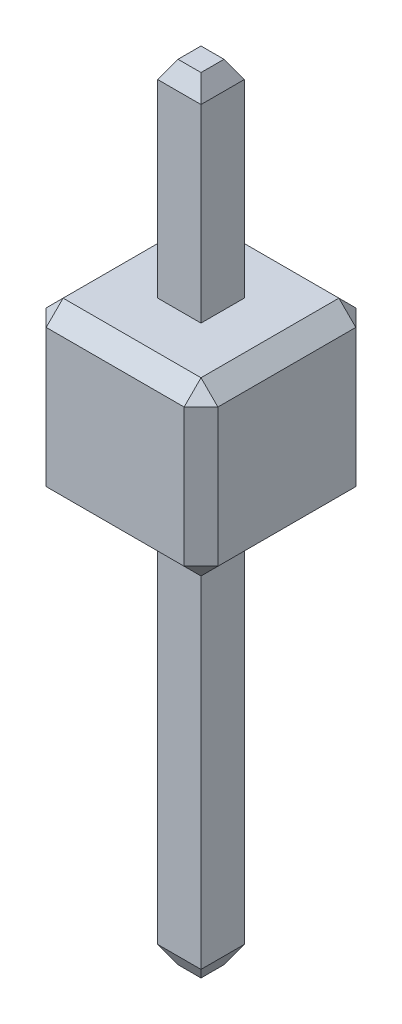
ISO-10303-21;
HEADER;
FILE_DESCRIPTION(('STEP AP214'),'2;1');
FILE_NAME('part.step','',(''),(''),'','','');
FILE_SCHEMA(('AUTOMOTIVE_DESIGN { 1 0 10303 214 1 1 1 1 }'));
ENDSEC;
DATA;
#1=APPLICATION_CONTEXT('core data for automotive mechanical design processes');
#2=APPLICATION_PROTOCOL_DEFINITION('international standard','automotive_design',2000,#1);
#3=PRODUCT_CONTEXT('',#1,'mechanical');
#4=PRODUCT('Part','Part','',(#3));
#5=PRODUCT_RELATED_PRODUCT_CATEGORY('part','',(#4));
#6=PRODUCT_DEFINITION_FORMATION('','',#4);
#7=PRODUCT_DEFINITION_CONTEXT('part definition',#1,'design');
#8=PRODUCT_DEFINITION('design','',#6,#7);
#9=PRODUCT_DEFINITION_SHAPE('','',#8);
#10=(LENGTH_UNIT() NAMED_UNIT(*) SI_UNIT(.MILLI.,.METRE.));
#11=(NAMED_UNIT(*) PLANE_ANGLE_UNIT() SI_UNIT($,.RADIAN.));
#12=(NAMED_UNIT(*) SI_UNIT($,.STERADIAN.) SOLID_ANGLE_UNIT());
#13=UNCERTAINTY_MEASURE_WITH_UNIT(LENGTH_MEASURE(1.E-05),#10,'distance_accuracy_value','');
#14=(GEOMETRIC_REPRESENTATION_CONTEXT(3) GLOBAL_UNCERTAINTY_ASSIGNED_CONTEXT((#13)) GLOBAL_UNIT_ASSIGNED_CONTEXT((#10,
#11,#12)) REPRESENTATION_CONTEXT('',''));
#15=CARTESIAN_POINT('',(0.,0.,0.));
#16=DIRECTION('',(0.,0.,1.));
#17=DIRECTION('',(1.,0.,0.));
#18=AXIS2_PLACEMENT_3D('',#15,#16,#17);
#19=CARTESIAN_POINT('',(0.319999999999999,5.8,0.32));
#20=DIRECTION('',(-1.,0.,0.));
#21=DIRECTION('',(0.,-1.,0.));
#22=AXIS2_PLACEMENT_3D('',#19,#20,#21);
#23=PLANE('',#22);
#24=DIRECTION('',(0.,1.,0.));
#25=VECTOR('',#24,1.);
#26=CARTESIAN_POINT('',(0.319999999999999,5.8,0.32));
#27=LINE('',#26,#25);
#28=CARTESIAN_POINT('',(0.320000000000001,-5.54,0.32));
#29=VERTEX_POINT('',#28);
#30=CARTESIAN_POINT('',(0.32,0.199999999999997,0.32));
#31=VERTEX_POINT('',#30);
#32=EDGE_CURVE('E608',#29,#31,#27,.T.);
#33=ORIENTED_EDGE('',*,*,#32,.F.);
#34=DIRECTION('',(0.,0.,-1.));
#35=VECTOR('',#34,1.);
#36=CARTESIAN_POINT('',(0.320000000000001,-5.54,0.32));
#37=LINE('',#36,#35);
#38=CARTESIAN_POINT('',(0.320000000000001,-5.54,-0.32));
#39=VERTEX_POINT('',#38);
#40=EDGE_CURVE('E314',#29,#39,#37,.T.);
#41=ORIENTED_EDGE('',*,*,#40,.T.);
#42=DIRECTION('',(0.,1.,0.));
#43=VECTOR('',#42,1.);
#44=CARTESIAN_POINT('',(0.319999999999999,5.8,-0.32));
#45=LINE('',#44,#43);
#46=CARTESIAN_POINT('',(0.32,0.199999999999997,-0.32));
#47=VERTEX_POINT('',#46);
#48=EDGE_CURVE('E228',#39,#47,#45,.T.);
#49=ORIENTED_EDGE('',*,*,#48,.T.);
#50=DIRECTION('',(0.,0.,-1.));
#51=VECTOR('',#50,1.);
#52=CARTESIAN_POINT('',(0.32,0.199999999999998,0.32));
#53=LINE('',#52,#51);
#54=EDGE_CURVE('E600',#31,#47,#53,.T.);
#55=ORIENTED_EDGE('',*,*,#54,.F.);
#56=EDGE_LOOP('',(#33,#41,#49,#55));
#57=FACE_BOUND('',#56,.T.);
#58=ADVANCED_FACE('F53',(#57),#23,.F.);
#59=CARTESIAN_POINT('',(-0.320000000000001,5.8,0.32));
#60=DIRECTION('',(1.,0.,0.));
#61=DIRECTION('',(0.,1.,0.));
#62=AXIS2_PLACEMENT_3D('',#59,#60,#61);
#63=PLANE('',#62);
#64=DIRECTION('',(0.,-1.,0.));
#65=VECTOR('',#64,1.);
#66=CARTESIAN_POINT('',(-0.320000000000001,5.8,-0.32));
#67=LINE('',#66,#65);
#68=CARTESIAN_POINT('',(-0.320000000000001,0.199999999999997,-0.32));
#69=VERTEX_POINT('',#68);
#70=CARTESIAN_POINT('',(-0.319999999999999,-5.54,-0.32));
#71=VERTEX_POINT('',#70);
#72=EDGE_CURVE('E611',#69,#71,#67,.T.);
#73=ORIENTED_EDGE('',*,*,#72,.T.);
#74=DIRECTION('',(0.,0.,1.));
#75=VECTOR('',#74,1.);
#76=CARTESIAN_POINT('',(-0.319999999999999,-5.54,0.32));
#77=LINE('',#76,#75);
#78=CARTESIAN_POINT('',(-0.319999999999999,-5.54,0.32));
#79=VERTEX_POINT('',#78);
#80=EDGE_CURVE('E320',#71,#79,#77,.T.);
#81=ORIENTED_EDGE('',*,*,#80,.T.);
#82=DIRECTION('',(0.,-1.,0.));
#83=VECTOR('',#82,1.);
#84=CARTESIAN_POINT('',(-0.320000000000001,5.8,0.32));
#85=LINE('',#84,#83);
#86=CARTESIAN_POINT('',(-0.32,0.199999999999997,0.32));
#87=VERTEX_POINT('',#86);
#88=EDGE_CURVE('E254',#87,#79,#85,.T.);
#89=ORIENTED_EDGE('',*,*,#88,.F.);
#90=DIRECTION('',(0.,0.,1.));
#91=VECTOR('',#90,1.);
#92=CARTESIAN_POINT('',(-0.32,0.199999999999998,0.32));
#93=LINE('',#92,#91);
#94=EDGE_CURVE('E596',#69,#87,#93,.T.);
#95=ORIENTED_EDGE('',*,*,#94,.F.);
#96=EDGE_LOOP('',(#73,#81,#89,#95));
#97=FACE_BOUND('',#96,.T.);
#98=ADVANCED_FACE('F532',(#97),#63,.F.);
#99=CARTESIAN_POINT('',(0.,0.,0.32));
#100=DIRECTION('',(0.,0.,1.));
#101=DIRECTION('',(1.,0.,0.));
#102=AXIS2_PLACEMENT_3D('',#99,#100,#101);
#103=PLANE('',#102);
#104=ORIENTED_EDGE('',*,*,#88,.T.);
#105=DIRECTION('',(1.,0.,0.));
#106=VECTOR('',#105,1.);
#107=CARTESIAN_POINT('',(0.320000000000001,-5.54,0.32));
#108=LINE('',#107,#106);
#109=EDGE_CURVE('E282',#79,#29,#108,.T.);
#110=ORIENTED_EDGE('',*,*,#109,.T.);
#111=ORIENTED_EDGE('',*,*,#32,.T.);
#112=DIRECTION('',(-1.,0.,0.));
#113=VECTOR('',#112,1.);
#114=CARTESIAN_POINT('',(0.,0.199999999999997,0.32));
#115=LINE('',#114,#113);
#116=EDGE_CURVE('E229',#31,#87,#115,.T.);
#117=ORIENTED_EDGE('',*,*,#116,.T.);
#118=EDGE_LOOP('',(#104,#110,#111,#117));
#119=FACE_BOUND('',#118,.T.);
#120=ADVANCED_FACE('F539',(#119),#103,.T.);
#121=CARTESIAN_POINT('',(0.,0.,-0.32));
#122=DIRECTION('',(0.,0.,1.));
#123=DIRECTION('',(1.,0.,0.));
#124=AXIS2_PLACEMENT_3D('',#121,#122,#123);
#125=PLANE('',#124);
#126=ORIENTED_EDGE('',*,*,#48,.F.);
#127=DIRECTION('',(-1.,0.,0.));
#128=VECTOR('',#127,1.);
#129=CARTESIAN_POINT('',(0.,-5.54,-0.32));
#130=LINE('',#129,#128);
#131=EDGE_CURVE('E317',#39,#71,#130,.T.);
#132=ORIENTED_EDGE('',*,*,#131,.T.);
#133=ORIENTED_EDGE('',*,*,#72,.F.);
#134=DIRECTION('',(-1.,0.,0.));
#135=VECTOR('',#134,1.);
#136=CARTESIAN_POINT('',(0.,0.199999999999997,-0.32));
#137=LINE('',#136,#135);
#138=EDGE_CURVE('E246',#47,#69,#137,.T.);
#139=ORIENTED_EDGE('',*,*,#138,.F.);
#140=EDGE_LOOP('',(#126,#132,#133,#139));
#141=FACE_BOUND('',#140,.T.);
#142=ADVANCED_FACE('F573',(#141),#125,.F.);
#143=CARTESIAN_POINT('',(-0.319999999999999,-5.8,0.32));
#144=DIRECTION('',(0.,1.,0.));
#145=DIRECTION('',(0.,0.,1.));
#146=AXIS2_PLACEMENT_3D('',#143,#144,#145);
#147=PLANE('',#146);
#148=DIRECTION('',(0.,0.,1.));
#149=VECTOR('',#148,1.);
#150=CARTESIAN_POINT('',(0.169999999999999,-5.8,0.32));
#151=LINE('',#150,#149);
#152=CARTESIAN_POINT('',(0.169999999999999,-5.8,-0.169999999999998));
#153=VERTEX_POINT('',#152);
#154=CARTESIAN_POINT('',(0.169999999999999,-5.8,0.169999999999998));
#155=VERTEX_POINT('',#154);
#156=EDGE_CURVE('E307',#153,#155,#151,.T.);
#157=ORIENTED_EDGE('',*,*,#156,.T.);
#158=DIRECTION('',(-1.,0.,0.));
#159=VECTOR('',#158,1.);
#160=CARTESIAN_POINT('',(-0.319999999999999,-5.8,0.169999999999998));
#161=LINE('',#160,#159);
#162=CARTESIAN_POINT('',(-0.169999999999998,-5.8,0.169999999999998));
#163=VERTEX_POINT('',#162);
#164=EDGE_CURVE('E310',#155,#163,#161,.T.);
#165=ORIENTED_EDGE('',*,*,#164,.T.);
#166=DIRECTION('',(0.,0.,-1.));
#167=VECTOR('',#166,1.);
#168=CARTESIAN_POINT('',(-0.169999999999998,-5.8,0.32));
#169=LINE('',#168,#167);
#170=CARTESIAN_POINT('',(-0.169999999999998,-5.8,-0.169999999999998));
#171=VERTEX_POINT('',#170);
#172=EDGE_CURVE('E301',#163,#171,#169,.T.);
#173=ORIENTED_EDGE('',*,*,#172,.T.);
#174=DIRECTION('',(1.,0.,0.));
#175=VECTOR('',#174,1.);
#176=CARTESIAN_POINT('',(-0.319999999999999,-5.8,-0.169999999999998));
#177=LINE('',#176,#175);
#178=EDGE_CURVE('E304',#171,#153,#177,.T.);
#179=ORIENTED_EDGE('',*,*,#178,.T.);
#180=EDGE_LOOP('',(#157,#165,#173,#179));
#181=FACE_BOUND('',#180,.T.);
#182=ADVANCED_FACE('F564',(#181),#147,.F.);
#183=CARTESIAN_POINT('',(-1.27,2.74,1.27));
#184=DIRECTION('',(1.,0.,0.));
#185=DIRECTION('',(0.,1.,0.));
#186=AXIS2_PLACEMENT_3D('',#183,#184,#185);
#187=PLANE('',#186);
#188=DIRECTION('',(0.,1.,0.));
#189=VECTOR('',#188,1.);
#190=CARTESIAN_POINT('',(-1.27,2.74,1.02));
#191=LINE('',#190,#189);
#192=CARTESIAN_POINT('',(-1.27,0.449999999999999,1.02));
#193=VERTEX_POINT('',#192);
#194=CARTESIAN_POINT('',(-1.27,2.49,1.02));
#195=VERTEX_POINT('',#194);
#196=EDGE_CURVE('E342',#193,#195,#191,.T.);
#197=ORIENTED_EDGE('',*,*,#196,.T.);
#198=DIRECTION('',(0.,0.,-1.));
#199=VECTOR('',#198,1.);
#200=CARTESIAN_POINT('',(-1.27,2.49,1.27));
#201=LINE('',#200,#199);
#202=CARTESIAN_POINT('',(-1.27,2.49,-1.02));
#203=VERTEX_POINT('',#202);
#204=EDGE_CURVE('E345',#195,#203,#201,.T.);
#205=ORIENTED_EDGE('',*,*,#204,.T.);
#206=DIRECTION('',(0.,-1.,0.));
#207=VECTOR('',#206,1.);
#208=CARTESIAN_POINT('',(-1.27,0.199999999999997,-1.02));
#209=LINE('',#208,#207);
#210=CARTESIAN_POINT('',(-1.27,0.449999999999999,-1.02));
#211=VERTEX_POINT('',#210);
#212=EDGE_CURVE('E323',#203,#211,#209,.T.);
#213=ORIENTED_EDGE('',*,*,#212,.T.);
#214=DIRECTION('',(0.,0.,1.));
#215=VECTOR('',#214,1.);
#216=CARTESIAN_POINT('',(-1.27,0.449999999999999,1.27));
#217=LINE('',#216,#215);
#218=EDGE_CURVE('E339',#211,#193,#217,.T.);
#219=ORIENTED_EDGE('',*,*,#218,.T.);
#220=EDGE_LOOP('',(#197,#205,#213,#219));
#221=FACE_BOUND('',#220,.T.);
#222=ADVANCED_FACE('F648',(#221),#187,.F.);
#223=CARTESIAN_POINT('',(1.27,0.199999999999998,1.27));
#224=DIRECTION('',(0.,1.,0.));
#225=DIRECTION('',(-1.,0.,0.));
#226=AXIS2_PLACEMENT_3D('',#223,#224,#225);
#227=PLANE('',#226);
#228=DIRECTION('',(1.,0.,0.));
#229=VECTOR('',#228,1.);
#230=CARTESIAN_POINT('',(1.27,0.199999999999998,-1.02));
#231=LINE('',#230,#229);
#232=CARTESIAN_POINT('',(-1.02,0.199999999999997,-1.02));
#233=VERTEX_POINT('',#232);
#234=CARTESIAN_POINT('',(1.02,0.199999999999998,-1.02));
#235=VERTEX_POINT('',#234);
#236=EDGE_CURVE('E401',#233,#235,#231,.T.);
#237=ORIENTED_EDGE('',*,*,#236,.T.);
#238=DIRECTION('',(0.,0.,1.));
#239=VECTOR('',#238,1.);
#240=CARTESIAN_POINT('',(1.02,0.199999999999998,1.27));
#241=LINE('',#240,#239);
#242=CARTESIAN_POINT('',(1.02,0.199999999999998,1.02));
#243=VERTEX_POINT('',#242);
#244=EDGE_CURVE('E11',#235,#243,#241,.T.);
#245=ORIENTED_EDGE('',*,*,#244,.T.);
#246=DIRECTION('',(-1.,0.,0.));
#247=VECTOR('',#246,1.);
#248=CARTESIAN_POINT('',(1.27,0.199999999999998,1.02));
#249=LINE('',#248,#247);
#250=CARTESIAN_POINT('',(-1.02,0.199999999999997,1.02));
#251=VERTEX_POINT('',#250);
#252=EDGE_CURVE('E64',#243,#251,#249,.T.);
#253=ORIENTED_EDGE('',*,*,#252,.T.);
#254=DIRECTION('',(0.,0.,-1.));
#255=VECTOR('',#254,1.);
#256=CARTESIAN_POINT('',(-1.02,0.199999999999997,1.27));
#257=LINE('',#256,#255);
#258=EDGE_CURVE('E404',#251,#233,#257,.T.);
#259=ORIENTED_EDGE('',*,*,#258,.T.);
#260=EDGE_LOOP('',(#237,#245,#253,#259));
#261=FACE_BOUND('',#260,.T.);
#262=ORIENTED_EDGE('',*,*,#116,.F.);
#263=ORIENTED_EDGE('',*,*,#54,.T.);
#264=ORIENTED_EDGE('',*,*,#138,.T.);
#265=ORIENTED_EDGE('',*,*,#94,.T.);
#266=EDGE_LOOP('',(#262,#263,#264,#265));
#267=FACE_BOUND('',#266,.T.);
#268=ADVANCED_FACE('F654',(#261,#267),#227,.F.);
#269=CARTESIAN_POINT('',(1.27,2.74,1.27));
#270=DIRECTION('',(-1.,0.,0.));
#271=DIRECTION('',(0.,-1.,0.));
#272=AXIS2_PLACEMENT_3D('',#269,#270,#271);
#273=PLANE('',#272);
#274=DIRECTION('',(0.,0.,1.));
#275=VECTOR('',#274,1.);
#276=CARTESIAN_POINT('',(1.27,2.49,1.27));
#277=LINE('',#276,#275);
#278=CARTESIAN_POINT('',(1.27,2.49,-1.02));
#279=VERTEX_POINT('',#278);
#280=CARTESIAN_POINT('',(1.27,2.49,1.02));
#281=VERTEX_POINT('',#280);
#282=EDGE_CURVE('E381',#279,#281,#277,.T.);
#283=ORIENTED_EDGE('',*,*,#282,.T.);
#284=DIRECTION('',(0.,-1.,0.));
#285=VECTOR('',#284,1.);
#286=CARTESIAN_POINT('',(1.27,2.74,1.02));
#287=LINE('',#286,#285);
#288=CARTESIAN_POINT('',(1.27,0.449999999999999,1.02));
#289=VERTEX_POINT('',#288);
#290=EDGE_CURVE('E385',#281,#289,#287,.T.);
#291=ORIENTED_EDGE('',*,*,#290,.T.);
#292=DIRECTION('',(0.,0.,-1.));
#293=VECTOR('',#292,1.);
#294=CARTESIAN_POINT('',(1.27,0.449999999999999,1.27));
#295=LINE('',#294,#293);
#296=CARTESIAN_POINT('',(1.27,0.449999999999999,-1.02));
#297=VERTEX_POINT('',#296);
#298=EDGE_CURVE('E378',#289,#297,#295,.T.);
#299=ORIENTED_EDGE('',*,*,#298,.T.);
#300=DIRECTION('',(0.,1.,0.));
#301=VECTOR('',#300,1.);
#302=CARTESIAN_POINT('',(1.27,2.74,-1.02));
#303=LINE('',#302,#301);
#304=EDGE_CURVE('E375',#297,#279,#303,.T.);
#305=ORIENTED_EDGE('',*,*,#304,.T.);
#306=EDGE_LOOP('',(#283,#291,#299,#305));
#307=FACE_BOUND('',#306,.T.);
#308=ADVANCED_FACE('F663',(#307),#273,.F.);
#309=CARTESIAN_POINT('',(1.27,2.74,1.27));
#310=DIRECTION('',(0.,-1.,0.));
#311=DIRECTION('',(1.,0.,0.));
#312=AXIS2_PLACEMENT_3D('',#309,#310,#311);
#313=PLANE('',#312);
#314=DIRECTION('',(-1.,0.,0.));
#315=VECTOR('',#314,1.);
#316=CARTESIAN_POINT('',(-1.27,2.74,-1.02));
#317=LINE('',#316,#315);
#318=CARTESIAN_POINT('',(1.02,2.74,-1.02));
#319=VERTEX_POINT('',#318);
#320=CARTESIAN_POINT('',(-1.02,2.74,-1.02));
#321=VERTEX_POINT('',#320);
#322=EDGE_CURVE('E349',#319,#321,#317,.T.);
#323=ORIENTED_EDGE('',*,*,#322,.T.);
#324=DIRECTION('',(0.,0.,1.));
#325=VECTOR('',#324,1.);
#326=CARTESIAN_POINT('',(-1.02,2.74,1.27));
#327=LINE('',#326,#325);
#328=CARTESIAN_POINT('',(-1.02,2.74,1.02));
#329=VERTEX_POINT('',#328);
#330=EDGE_CURVE('E358',#321,#329,#327,.T.);
#331=ORIENTED_EDGE('',*,*,#330,.T.);
#332=DIRECTION('',(1.,0.,0.));
#333=VECTOR('',#332,1.);
#334=CARTESIAN_POINT('',(1.27,2.74,1.02));
#335=LINE('',#334,#333);
#336=CARTESIAN_POINT('',(1.02,2.74,1.02));
#337=VERTEX_POINT('',#336);
#338=EDGE_CURVE('E355',#329,#337,#335,.T.);
#339=ORIENTED_EDGE('',*,*,#338,.T.);
#340=DIRECTION('',(0.,0.,-1.));
#341=VECTOR('',#340,1.);
#342=CARTESIAN_POINT('',(1.02,2.74,1.27));
#343=LINE('',#342,#341);
#344=EDGE_CURVE('E352',#337,#319,#343,.T.);
#345=ORIENTED_EDGE('',*,*,#344,.T.);
#346=EDGE_LOOP('',(#323,#331,#339,#345));
#347=FACE_BOUND('',#346,.T.);
#348=DIRECTION('',(1.,0.,0.));
#349=VECTOR('',#348,1.);
#350=CARTESIAN_POINT('',(0.,2.74,0.32));
#351=LINE('',#350,#349);
#352=CARTESIAN_POINT('',(-0.32,2.74,0.32));
#353=VERTEX_POINT('',#352);
#354=CARTESIAN_POINT('',(0.32,2.74,0.32));
#355=VERTEX_POINT('',#354);
#356=EDGE_CURVE('E240',#353,#355,#351,.T.);
#357=ORIENTED_EDGE('',*,*,#356,.F.);
#358=DIRECTION('',(0.,0.,-1.));
#359=VECTOR('',#358,1.);
#360=CARTESIAN_POINT('',(-0.32,2.74,0.32));
#361=LINE('',#360,#359);
#362=CARTESIAN_POINT('',(-0.32,2.74,-0.32));
#363=VERTEX_POINT('',#362);
#364=EDGE_CURVE('E241',#353,#363,#361,.T.);
#365=ORIENTED_EDGE('',*,*,#364,.T.);
#366=DIRECTION('',(1.,0.,0.));
#367=VECTOR('',#366,1.);
#368=CARTESIAN_POINT('',(0.,2.74,-0.32));
#369=LINE('',#368,#367);
#370=CARTESIAN_POINT('',(0.320000000000001,2.74,-0.32));
#371=VERTEX_POINT('',#370);
#372=EDGE_CURVE('E222',#363,#371,#369,.T.);
#373=ORIENTED_EDGE('',*,*,#372,.T.);
#374=DIRECTION('',(0.,0.,1.));
#375=VECTOR('',#374,1.);
#376=CARTESIAN_POINT('',(0.32,2.74,0.32));
#377=LINE('',#376,#375);
#378=EDGE_CURVE('E233',#371,#355,#377,.T.);
#379=ORIENTED_EDGE('',*,*,#378,.T.);
#380=EDGE_LOOP('',(#357,#365,#373,#379));
#381=FACE_BOUND('',#380,.T.);
#382=ADVANCED_FACE('F243',(#347,#381),#313,.F.);
#383=CARTESIAN_POINT('',(0.,0.,1.27));
#384=DIRECTION('',(0.,0.,-1.));
#385=DIRECTION('',(-1.,0.,0.));
#386=AXIS2_PLACEMENT_3D('',#383,#384,#385);
#387=PLANE('',#386);
#388=DIRECTION('',(0.,1.,0.));
#389=VECTOR('',#388,1.);
#390=CARTESIAN_POINT('',(1.02,0.,1.27));
#391=LINE('',#390,#389);
#392=CARTESIAN_POINT('',(1.02,0.45,1.27));
#393=VERTEX_POINT('',#392);
#394=CARTESIAN_POINT('',(1.02,2.49,1.27));
#395=VERTEX_POINT('',#394);
#396=EDGE_CURVE('E368',#393,#395,#391,.T.);
#397=ORIENTED_EDGE('',*,*,#396,.T.);
#398=DIRECTION('',(-1.,0.,0.));
#399=VECTOR('',#398,1.);
#400=CARTESIAN_POINT('',(0.,2.49,1.27));
#401=LINE('',#400,#399);
#402=CARTESIAN_POINT('',(-1.02,2.49,1.27));
#403=VERTEX_POINT('',#402);
#404=EDGE_CURVE('E371',#395,#403,#401,.T.);
#405=ORIENTED_EDGE('',*,*,#404,.T.);
#406=DIRECTION('',(0.,-1.,0.));
#407=VECTOR('',#406,1.);
#408=CARTESIAN_POINT('',(-1.02,0.,1.27));
#409=LINE('',#408,#407);
#410=CARTESIAN_POINT('',(-1.02,0.449999999999999,1.27));
#411=VERTEX_POINT('',#410);
#412=EDGE_CURVE('E362',#403,#411,#409,.T.);
#413=ORIENTED_EDGE('',*,*,#412,.T.);
#414=DIRECTION('',(1.,0.,0.));
#415=VECTOR('',#414,1.);
#416=CARTESIAN_POINT('',(0.,0.449999999999999,1.27));
#417=LINE('',#416,#415);
#418=EDGE_CURVE('E365',#411,#393,#417,.T.);
#419=ORIENTED_EDGE('',*,*,#418,.T.);
#420=EDGE_LOOP('',(#397,#405,#413,#419));
#421=FACE_BOUND('',#420,.T.);
#422=ADVANCED_FACE('F513',(#421),#387,.F.);
#423=CARTESIAN_POINT('',(0.,0.,-1.27));
#424=DIRECTION('',(0.,0.,-1.));
#425=DIRECTION('',(-1.,0.,0.));
#426=AXIS2_PLACEMENT_3D('',#423,#424,#425);
#427=PLANE('',#426);
#428=DIRECTION('',(0.,1.,0.));
#429=VECTOR('',#428,1.);
#430=CARTESIAN_POINT('',(-1.02,2.74,-1.27));
#431=LINE('',#430,#429);
#432=CARTESIAN_POINT('',(-1.02,0.449999999999999,-1.27));
#433=VERTEX_POINT('',#432);
#434=CARTESIAN_POINT('',(-1.02,2.49,-1.27));
#435=VERTEX_POINT('',#434);
#436=EDGE_CURVE('E388',#433,#435,#431,.T.);
#437=ORIENTED_EDGE('',*,*,#436,.T.);
#438=DIRECTION('',(1.,0.,0.));
#439=VECTOR('',#438,1.);
#440=CARTESIAN_POINT('',(1.27,2.49,-1.27));
#441=LINE('',#440,#439);
#442=CARTESIAN_POINT('',(1.02,2.49,-1.27));
#443=VERTEX_POINT('',#442);
#444=EDGE_CURVE('E397',#435,#443,#441,.T.);
#445=ORIENTED_EDGE('',*,*,#444,.T.);
#446=DIRECTION('',(0.,-1.,0.));
#447=VECTOR('',#446,1.);
#448=CARTESIAN_POINT('',(1.02,0.199999999999998,-1.27));
#449=LINE('',#448,#447);
#450=CARTESIAN_POINT('',(1.02,0.45,-1.27));
#451=VERTEX_POINT('',#450);
#452=EDGE_CURVE('E394',#443,#451,#449,.T.);
#453=ORIENTED_EDGE('',*,*,#452,.T.);
#454=DIRECTION('',(-1.,0.,0.));
#455=VECTOR('',#454,1.);
#456=CARTESIAN_POINT('',(-1.27,0.449999999999999,-1.27));
#457=LINE('',#456,#455);
#458=EDGE_CURVE('E391',#451,#433,#457,.T.);
#459=ORIENTED_EDGE('',*,*,#458,.T.);
#460=EDGE_LOOP('',(#437,#445,#453,#459));
#461=FACE_BOUND('',#460,.T.);
#462=ADVANCED_FACE('F568',(#461),#427,.T.);
#463=CARTESIAN_POINT('',(-0.320000000000001,5.8,0.32));
#464=DIRECTION('',(0.,-1.,0.));
#465=DIRECTION('',(0.,0.,-1.));
#466=AXIS2_PLACEMENT_3D('',#463,#464,#465);
#467=PLANE('',#466);
#468=DIRECTION('',(0.,0.,-1.));
#469=VECTOR('',#468,1.);
#470=CARTESIAN_POINT('',(0.17,5.8,0.32));
#471=LINE('',#470,#469);
#472=CARTESIAN_POINT('',(0.17,5.8,0.17));
#473=VERTEX_POINT('',#472);
#474=CARTESIAN_POINT('',(0.17,5.8,-0.17));
#475=VERTEX_POINT('',#474);
#476=EDGE_CURVE('E264',#473,#475,#471,.T.);
#477=ORIENTED_EDGE('',*,*,#476,.T.);
#478=DIRECTION('',(-1.,0.,0.));
#479=VECTOR('',#478,1.);
#480=CARTESIAN_POINT('',(-0.320000000000001,5.8,-0.17));
#481=LINE('',#480,#479);
#482=CARTESIAN_POINT('',(-0.170000000000001,5.8,-0.17));
#483=VERTEX_POINT('',#482);
#484=EDGE_CURVE('E267',#475,#483,#481,.T.);
#485=ORIENTED_EDGE('',*,*,#484,.T.);
#486=DIRECTION('',(0.,0.,1.));
#487=VECTOR('',#486,1.);
#488=CARTESIAN_POINT('',(-0.170000000000001,5.8,0.32));
#489=LINE('',#488,#487);
#490=CARTESIAN_POINT('',(-0.170000000000001,5.8,0.17));
#491=VERTEX_POINT('',#490);
#492=EDGE_CURVE('E252',#483,#491,#489,.T.);
#493=ORIENTED_EDGE('',*,*,#492,.T.);
#494=DIRECTION('',(1.,0.,0.));
#495=VECTOR('',#494,1.);
#496=CARTESIAN_POINT('',(0.319999999999999,5.8,0.17));
#497=LINE('',#496,#495);
#498=EDGE_CURVE('E261',#491,#473,#497,.T.);
#499=ORIENTED_EDGE('',*,*,#498,.T.);
#500=EDGE_LOOP('',(#477,#485,#493,#499));
#501=FACE_BOUND('',#500,.T.);
#502=ADVANCED_FACE('F566',(#501),#467,.F.);
#503=CARTESIAN_POINT('',(-0.320000000000001,5.54,-0.32));
#504=VERTEX_POINT('',#503);
#505=EDGE_CURVE('E257',#504,#363,#67,.T.);
#506=ORIENTED_EDGE('',*,*,#505,.F.);
#507=DIRECTION('',(1.,0.,0.));
#508=VECTOR('',#507,1.);
#509=CARTESIAN_POINT('',(0.,5.54,-0.32));
#510=LINE('',#509,#508);
#511=CARTESIAN_POINT('',(0.319999999999999,5.54,-0.32));
#512=VERTEX_POINT('',#511);
#513=EDGE_CURVE('E225',#504,#512,#510,.T.);
#514=ORIENTED_EDGE('',*,*,#513,.T.);
#515=EDGE_CURVE('E217',#371,#512,#45,.T.);
#516=ORIENTED_EDGE('',*,*,#515,.F.);
#517=ORIENTED_EDGE('',*,*,#372,.F.);
#518=EDGE_LOOP('',(#506,#514,#516,#517));
#519=FACE_BOUND('',#518,.T.);
#520=ADVANCED_FACE('F220',(#519),#125,.F.);
#521=CARTESIAN_POINT('',(0.319999999999999,5.54,0.32));
#522=VERTEX_POINT('',#521);
#523=EDGE_CURVE('E236',#355,#522,#27,.T.);
#524=ORIENTED_EDGE('',*,*,#523,.T.);
#525=DIRECTION('',(-1.,0.,0.));
#526=VECTOR('',#525,1.);
#527=CARTESIAN_POINT('',(-0.320000000000001,5.54,0.32));
#528=LINE('',#527,#526);
#529=CARTESIAN_POINT('',(-0.320000000000001,5.54,0.32));
#530=VERTEX_POINT('',#529);
#531=EDGE_CURVE('E276',#522,#530,#528,.T.);
#532=ORIENTED_EDGE('',*,*,#531,.T.);
#533=EDGE_CURVE('E247',#530,#353,#85,.T.);
#534=ORIENTED_EDGE('',*,*,#533,.T.);
#535=ORIENTED_EDGE('',*,*,#356,.T.);
#536=EDGE_LOOP('',(#524,#532,#534,#535));
#537=FACE_BOUND('',#536,.T.);
#538=ADVANCED_FACE('F555',(#537),#103,.T.);
#539=ORIENTED_EDGE('',*,*,#533,.F.);
#540=DIRECTION('',(0.,0.,-1.));
#541=VECTOR('',#540,1.);
#542=CARTESIAN_POINT('',(-0.320000000000001,5.54,0.32));
#543=LINE('',#542,#541);
#544=EDGE_CURVE('E279',#530,#504,#543,.T.);
#545=ORIENTED_EDGE('',*,*,#544,.T.);
#546=ORIENTED_EDGE('',*,*,#505,.T.);
#547=ORIENTED_EDGE('',*,*,#364,.F.);
#548=EDGE_LOOP('',(#539,#545,#546,#547));
#549=FACE_BOUND('',#548,.T.);
#550=ADVANCED_FACE('F542',(#549),#63,.F.);
#551=ORIENTED_EDGE('',*,*,#515,.T.);
#552=DIRECTION('',(0.,0.,1.));
#553=VECTOR('',#552,1.);
#554=CARTESIAN_POINT('',(0.319999999999999,5.54,0.32));
#555=LINE('',#554,#553);
#556=EDGE_CURVE('E273',#512,#522,#555,.T.);
#557=ORIENTED_EDGE('',*,*,#556,.T.);
#558=ORIENTED_EDGE('',*,*,#523,.F.);
#559=ORIENTED_EDGE('',*,*,#378,.F.);
#560=EDGE_LOOP('',(#551,#557,#558,#559));
#561=FACE_BOUND('',#560,.T.);
#562=ADVANCED_FACE('F234',(#561),#23,.F.);
#563=CARTESIAN_POINT('',(0.,5.54,0.32));
#564=DIRECTION('',(0.,0.499722453489575,0.866185586048602));
#565=DIRECTION('',(1.,0.,0.));
#566=AXIS2_PLACEMENT_3D('',#563,#564,#565);
#567=PLANE('',#566);
#568=DIRECTION('',(-0.44701496631161,-0.774825941606797,0.447014966311611));
#569=VECTOR('',#568,1.);
#570=CARTESIAN_POINT('',(-0.320000000000001,5.54,0.32));
#571=LINE('',#570,#569);
#572=EDGE_CURVE('E290',#530,#491,#571,.F.);
#573=ORIENTED_EDGE('',*,*,#572,.F.);
#574=ORIENTED_EDGE('',*,*,#531,.F.);
#575=DIRECTION('',(0.447014966311611,-0.774825941606797,0.447014966311611));
#576=VECTOR('',#575,1.);
#577=CARTESIAN_POINT('',(0.256056838365897,5.65083481349911,0.256056838365898));
#578=LINE('',#577,#576);
#579=EDGE_CURVE('E294',#473,#522,#578,.T.);
#580=ORIENTED_EDGE('',*,*,#579,.F.);
#581=ORIENTED_EDGE('',*,*,#498,.F.);
#582=EDGE_LOOP('',(#573,#574,#580,#581));
#583=FACE_BOUND('',#582,.T.);
#584=ADVANCED_FACE('F547',(#583),#567,.T.);
#585=CARTESIAN_POINT('',(0.17,5.8,0.32));
#586=DIRECTION('',(-0.866185586048602,-0.499722453489575,0.));
#587=DIRECTION('',(0.,0.,-1.));
#588=AXIS2_PLACEMENT_3D('',#585,#586,#587);
#589=PLANE('',#588);
#590=ORIENTED_EDGE('',*,*,#579,.T.);
#591=ORIENTED_EDGE('',*,*,#556,.F.);
#592=DIRECTION('',(-0.447014966311611,0.774825941606797,0.447014966311611));
#593=VECTOR('',#592,1.);
#594=CARTESIAN_POINT('',(0.07208703374778,5.96971580817051,-0.0720870337477805));
#595=LINE('',#594,#593);
#596=EDGE_CURVE('E286',#475,#512,#595,.F.);
#597=ORIENTED_EDGE('',*,*,#596,.F.);
#598=ORIENTED_EDGE('',*,*,#476,.F.);
#599=EDGE_LOOP('',(#590,#591,#597,#598));
#600=FACE_BOUND('',#599,.T.);
#601=ADVANCED_FACE('F552',(#600),#589,.F.);
#602=CARTESIAN_POINT('',(-0.320000000000001,5.54,0.32));
#603=DIRECTION('',(0.866185586048602,-0.499722453489575,0.));
#604=DIRECTION('',(0.,0.,-1.));
#605=AXIS2_PLACEMENT_3D('',#602,#603,#604);
#606=PLANE('',#605);
#607=ORIENTED_EDGE('',*,*,#572,.T.);
#608=ORIENTED_EDGE('',*,*,#492,.F.);
#609=DIRECTION('',(-0.44701496631161,-0.774825941606797,-0.447014966311611));
#610=VECTOR('',#609,1.);
#611=CARTESIAN_POINT('',(-0.192113676731796,5.76166962699822,-0.192113676731795));
#612=LINE('',#611,#610);
#613=EDGE_CURVE('E283',#504,#483,#612,.F.);
#614=ORIENTED_EDGE('',*,*,#613,.F.);
#615=ORIENTED_EDGE('',*,*,#544,.F.);
#616=EDGE_LOOP('',(#607,#608,#614,#615));
#617=FACE_BOUND('',#616,.T.);
#618=ADVANCED_FACE('F590',(#617),#606,.F.);
#619=CARTESIAN_POINT('',(-0.320000000000001,5.8,-0.17));
#620=DIRECTION('',(0.,-0.499722453489575,0.866185586048602));
#621=DIRECTION('',(-1.,0.,0.));
#622=AXIS2_PLACEMENT_3D('',#619,#620,#621);
#623=PLANE('',#622);
#624=ORIENTED_EDGE('',*,*,#596,.T.);
#625=ORIENTED_EDGE('',*,*,#513,.F.);
#626=ORIENTED_EDGE('',*,*,#613,.T.);
#627=ORIENTED_EDGE('',*,*,#484,.F.);
#628=EDGE_LOOP('',(#624,#625,#626,#627));
#629=FACE_BOUND('',#628,.T.);
#630=ADVANCED_FACE('F585',(#629),#623,.F.);
#631=CARTESIAN_POINT('',(-0.319999999999999,-5.8,-0.169999999999998));
#632=DIRECTION('',(0.,0.499722453489577,0.866185586048601));
#633=DIRECTION('',(1.,0.,0.));
#634=AXIS2_PLACEMENT_3D('',#631,#632,#633);
#635=PLANE('',#634);
#636=DIRECTION('',(-0.447014966311612,-0.774825941606795,0.447014966311612));
#637=VECTOR('',#636,1.);
#638=CARTESIAN_POINT('',(0.0720870337477794,-5.96971580817052,-0.0720870337477786));
#639=LINE('',#638,#637);
#640=EDGE_CURVE('E330',#153,#39,#639,.F.);
#641=ORIENTED_EDGE('',*,*,#640,.F.);
#642=ORIENTED_EDGE('',*,*,#178,.F.);
#643=DIRECTION('',(0.447014966311612,-0.774825941606795,0.447014966311612));
#644=VECTOR('',#643,1.);
#645=CARTESIAN_POINT('',(-0.0720870337477779,-5.96971580817052,-0.0720870337477786));
#646=LINE('',#645,#644);
#647=EDGE_CURVE('E287',#71,#171,#646,.T.);
#648=ORIENTED_EDGE('',*,*,#647,.F.);
#649=ORIENTED_EDGE('',*,*,#131,.F.);
#650=EDGE_LOOP('',(#641,#642,#648,#649));
#651=FACE_BOUND('',#650,.T.);
#652=ADVANCED_FACE('F644',(#651),#635,.F.);
#653=CARTESIAN_POINT('',(-0.169999999999998,-5.8,0.32));
#654=DIRECTION('',(0.866185586048601,0.499722453489577,0.));
#655=DIRECTION('',(0.,0.,-1.));
#656=AXIS2_PLACEMENT_3D('',#653,#654,#655);
#657=PLANE('',#656);
#658=ORIENTED_EDGE('',*,*,#647,.T.);
#659=ORIENTED_EDGE('',*,*,#172,.F.);
#660=DIRECTION('',(0.447014966311612,-0.774825941606795,-0.447014966311612));
#661=VECTOR('',#660,1.);
#662=CARTESIAN_POINT('',(-0.199973357015984,-5.74804618117229,0.199973357015984));
#663=LINE('',#662,#661);
#664=EDGE_CURVE('E327',#79,#163,#663,.T.);
#665=ORIENTED_EDGE('',*,*,#664,.F.);
#666=ORIENTED_EDGE('',*,*,#80,.F.);
#667=EDGE_LOOP('',(#658,#659,#665,#666));
#668=FACE_BOUND('',#667,.T.);
#669=ADVANCED_FACE('F631',(#668),#657,.F.);
#670=CARTESIAN_POINT('',(0.320000000000001,-5.54,0.32));
#671=DIRECTION('',(-0.866185586048601,0.499722453489577,0.));
#672=DIRECTION('',(0.,0.,-1.));
#673=AXIS2_PLACEMENT_3D('',#670,#671,#672);
#674=PLANE('',#673);
#675=ORIENTED_EDGE('',*,*,#640,.T.);
#676=ORIENTED_EDGE('',*,*,#40,.F.);
#677=DIRECTION('',(0.447014966311612,0.774825941606795,0.447014966311612));
#678=VECTOR('',#677,1.);
#679=CARTESIAN_POINT('',(0.320000000000001,-5.54,0.32));
#680=LINE('',#679,#678);
#681=EDGE_CURVE('E324',#155,#29,#680,.T.);
#682=ORIENTED_EDGE('',*,*,#681,.F.);
#683=ORIENTED_EDGE('',*,*,#156,.F.);
#684=EDGE_LOOP('',(#675,#676,#682,#683));
#685=FACE_BOUND('',#684,.T.);
#686=ADVANCED_FACE('F639',(#685),#674,.F.);
#687=CARTESIAN_POINT('',(0.,-5.54,0.32));
#688=DIRECTION('',(0.,-0.499722453489577,0.866185586048601));
#689=DIRECTION('',(-1.,0.,0.));
#690=AXIS2_PLACEMENT_3D('',#687,#688,#689);
#691=PLANE('',#690);
#692=ORIENTED_EDGE('',*,*,#664,.T.);
#693=ORIENTED_EDGE('',*,*,#164,.F.);
#694=ORIENTED_EDGE('',*,*,#681,.T.);
#695=ORIENTED_EDGE('',*,*,#109,.F.);
#696=EDGE_LOOP('',(#692,#693,#694,#695));
#697=FACE_BOUND('',#696,.T.);
#698=ADVANCED_FACE('F634',(#697),#691,.T.);
#699=CARTESIAN_POINT('',(1.27,0.449999999999999,1.27));
#700=DIRECTION('',(-0.707106781186547,0.707106781186548,0.));
#701=DIRECTION('',(0.,0.,-1.));
#702=AXIS2_PLACEMENT_3D('',#699,#700,#701);
#703=PLANE('',#702);
#704=DIRECTION('',(-0.707106781186547,-0.707106781186547,0.));
#705=VECTOR('',#704,1.);
#706=CARTESIAN_POINT('',(1.02,0.199999999999998,1.02));
#707=LINE('',#706,#705);
#708=EDGE_CURVE('E58',#243,#289,#707,.F.);
#709=ORIENTED_EDGE('',*,*,#708,.F.);
#710=ORIENTED_EDGE('',*,*,#244,.F.);
#711=DIRECTION('',(0.707106781186548,0.707106781186547,0.));
#712=VECTOR('',#711,1.);
#713=CARTESIAN_POINT('',(1.27,0.449999999999999,-1.02));
#714=LINE('',#713,#712);
#715=EDGE_CURVE('E490',#297,#235,#714,.F.);
#716=ORIENTED_EDGE('',*,*,#715,.F.);
#717=ORIENTED_EDGE('',*,*,#298,.F.);
#718=EDGE_LOOP('',(#709,#710,#716,#717));
#719=FACE_BOUND('',#718,.T.);
#720=ADVANCED_FACE('F56',(#719),#703,.F.);
#721=CARTESIAN_POINT('',(1.02,0.199999999999998,1.02));
#722=DIRECTION('',(0.577350269189626,-0.577350269189626,0.577350269189626));
#723=DIRECTION('',(0.,-0.707106781186548,-0.707106781186548));
#724=AXIS2_PLACEMENT_3D('',#721,#722,#723);
#725=PLANE('',#724);
#726=DIRECTION('',(0.,0.707106781186547,0.707106781186547));
#727=VECTOR('',#726,1.);
#728=CARTESIAN_POINT('',(1.02,0.199999999999998,1.02));
#729=LINE('',#728,#727);
#730=EDGE_CURVE('E484',#243,#393,#729,.T.);
#731=ORIENTED_EDGE('',*,*,#730,.F.);
#732=ORIENTED_EDGE('',*,*,#708,.T.);
#733=DIRECTION('',(0.707106781186548,0.,-0.707106781186547));
#734=VECTOR('',#733,1.);
#735=CARTESIAN_POINT('',(1.145,0.449999999999999,1.145));
#736=LINE('',#735,#734);
#737=EDGE_CURVE('E487',#393,#289,#736,.T.);
#738=ORIENTED_EDGE('',*,*,#737,.F.);
#739=EDGE_LOOP('',(#731,#732,#738));
#740=FACE_BOUND('',#739,.T.);
#741=ADVANCED_FACE('F502',(#740),#725,.T.);
#742=CARTESIAN_POINT('',(1.27,0.449999999999999,-1.02));
#743=DIRECTION('',(0.577350269189625,-0.577350269189626,-0.577350269189626));
#744=DIRECTION('',(0.,0.707106781186548,-0.707106781186547));
#745=AXIS2_PLACEMENT_3D('',#742,#743,#744);
#746=PLANE('',#745);
#747=DIRECTION('',(0.707106781186548,0.,0.707106781186547));
#748=VECTOR('',#747,1.);
#749=CARTESIAN_POINT('',(1.27,0.449999999999999,-1.02));
#750=LINE('',#749,#748);
#751=EDGE_CURVE('E476',#297,#451,#750,.F.);
#752=ORIENTED_EDGE('',*,*,#751,.F.);
#753=ORIENTED_EDGE('',*,*,#715,.T.);
#754=DIRECTION('',(0.,0.707106781186548,-0.707106781186548));
#755=VECTOR('',#754,1.);
#756=CARTESIAN_POINT('',(1.02,0.324999999999998,-1.145));
#757=LINE('',#756,#755);
#758=EDGE_CURVE('E480',#451,#235,#757,.F.);
#759=ORIENTED_EDGE('',*,*,#758,.F.);
#760=EDGE_LOOP('',(#752,#753,#759));
#761=FACE_BOUND('',#760,.T.);
#762=ADVANCED_FACE('F528',(#761),#746,.T.);
#763=CARTESIAN_POINT('',(1.02,0.,1.27));
#764=DIRECTION('',(-0.707106781186547,0.,-0.707106781186548));
#765=DIRECTION('',(0.,1.,0.));
#766=AXIS2_PLACEMENT_3D('',#763,#764,#765);
#767=PLANE('',#766);
#768=ORIENTED_EDGE('',*,*,#737,.T.);
#769=ORIENTED_EDGE('',*,*,#290,.F.);
#770=DIRECTION('',(-0.707106781186548,0.,0.707106781186547));
#771=VECTOR('',#770,1.);
#772=CARTESIAN_POINT('',(1.145,2.49,1.145));
#773=LINE('',#772,#771);
#774=EDGE_CURVE('E469',#395,#281,#773,.F.);
#775=ORIENTED_EDGE('',*,*,#774,.F.);
#776=ORIENTED_EDGE('',*,*,#396,.F.);
#777=EDGE_LOOP('',(#768,#769,#775,#776));
#778=FACE_BOUND('',#777,.T.);
#779=ADVANCED_FACE('F509',(#778),#767,.F.);
#780=CARTESIAN_POINT('',(0.,0.449999999999999,1.27));
#781=DIRECTION('',(0.,0.707106781186547,-0.707106781186547));
#782=DIRECTION('',(1.,0.,0.));
#783=AXIS2_PLACEMENT_3D('',#780,#781,#782);
#784=PLANE('',#783);
#785=ORIENTED_EDGE('',*,*,#730,.T.);
#786=ORIENTED_EDGE('',*,*,#418,.F.);
#787=DIRECTION('',(0.,-0.707106781186548,-0.707106781186548));
#788=VECTOR('',#787,1.);
#789=CARTESIAN_POINT('',(-1.02,0.199999999999997,1.02));
#790=LINE('',#789,#788);
#791=EDGE_CURVE('E465',#251,#411,#790,.F.);
#792=ORIENTED_EDGE('',*,*,#791,.F.);
#793=ORIENTED_EDGE('',*,*,#252,.F.);
#794=EDGE_LOOP('',(#785,#786,#792,#793));
#795=FACE_BOUND('',#794,.T.);
#796=ADVANCED_FACE('F517',(#795),#784,.F.);
#797=CARTESIAN_POINT('',(-1.02,0.199999999999997,1.27));
#798=DIRECTION('',(0.707106781186548,0.707106781186547,0.));
#799=DIRECTION('',(0.,0.,-1.));
#800=AXIS2_PLACEMENT_3D('',#797,#798,#799);
#801=PLANE('',#800);
#802=DIRECTION('',(0.707106781186547,-0.707106781186548,0.));
#803=VECTOR('',#802,1.);
#804=CARTESIAN_POINT('',(-1.02,0.199999999999997,-1.02));
#805=LINE('',#804,#803);
#806=EDGE_CURVE('E457',#233,#211,#805,.F.);
#807=ORIENTED_EDGE('',*,*,#806,.F.);
#808=ORIENTED_EDGE('',*,*,#258,.F.);
#809=DIRECTION('',(-0.707106781186547,0.707106781186548,0.));
#810=VECTOR('',#809,1.);
#811=CARTESIAN_POINT('',(-1.02,0.199999999999997,1.02));
#812=LINE('',#811,#810);
#813=EDGE_CURVE('E461',#193,#251,#812,.F.);
#814=ORIENTED_EDGE('',*,*,#813,.F.);
#815=ORIENTED_EDGE('',*,*,#218,.F.);
#816=EDGE_LOOP('',(#807,#808,#814,#815));
#817=FACE_BOUND('',#816,.T.);
#818=ADVANCED_FACE('F519',(#817),#801,.F.);
#819=CARTESIAN_POINT('',(1.27,0.199999999999998,-1.02));
#820=DIRECTION('',(0.,-0.707106781186547,-0.707106781186547));
#821=DIRECTION('',(-1.,0.,0.));
#822=AXIS2_PLACEMENT_3D('',#819,#820,#821);
#823=PLANE('',#822);
#824=ORIENTED_EDGE('',*,*,#758,.T.);
#825=ORIENTED_EDGE('',*,*,#236,.F.);
#826=DIRECTION('',(0.,-0.707106781186548,0.707106781186548));
#827=VECTOR('',#826,1.);
#828=CARTESIAN_POINT('',(-1.02,0.199999999999997,-1.02));
#829=LINE('',#828,#827);
#830=EDGE_CURVE('E453',#433,#233,#829,.T.);
#831=ORIENTED_EDGE('',*,*,#830,.F.);
#832=ORIENTED_EDGE('',*,*,#458,.F.);
#833=EDGE_LOOP('',(#824,#825,#831,#832));
#834=FACE_BOUND('',#833,.T.);
#835=ADVANCED_FACE('F525',(#834),#823,.T.);
#836=CARTESIAN_POINT('',(1.27,2.74,-1.02));
#837=DIRECTION('',(0.707106781186547,0.,-0.707106781186548));
#838=DIRECTION('',(0.,-1.,0.));
#839=AXIS2_PLACEMENT_3D('',#836,#837,#838);
#840=PLANE('',#839);
#841=ORIENTED_EDGE('',*,*,#751,.T.);
#842=ORIENTED_EDGE('',*,*,#452,.F.);
#843=DIRECTION('',(-0.707106781186548,0.,-0.707106781186547));
#844=VECTOR('',#843,1.);
#845=CARTESIAN_POINT('',(1.145,2.49,-1.145));
#846=LINE('',#845,#844);
#847=EDGE_CURVE('E449',#279,#443,#846,.T.);
#848=ORIENTED_EDGE('',*,*,#847,.F.);
#849=ORIENTED_EDGE('',*,*,#304,.F.);
#850=EDGE_LOOP('',(#841,#842,#848,#849));
#851=FACE_BOUND('',#850,.T.);
#852=ADVANCED_FACE('F723',(#851),#840,.T.);
#853=CARTESIAN_POINT('',(1.02,2.74,1.27));
#854=DIRECTION('',(-0.707106781186547,-0.707106781186547,0.));
#855=DIRECTION('',(0.,0.,-1.));
#856=AXIS2_PLACEMENT_3D('',#853,#854,#855);
#857=PLANE('',#856);
#858=DIRECTION('',(0.707106781186548,-0.707106781186548,0.));
#859=VECTOR('',#858,1.);
#860=CARTESIAN_POINT('',(1.02,2.74,1.02));
#861=LINE('',#860,#859);
#862=EDGE_CURVE('E472',#281,#337,#861,.F.);
#863=ORIENTED_EDGE('',*,*,#862,.F.);
#864=ORIENTED_EDGE('',*,*,#282,.F.);
#865=DIRECTION('',(-0.707106781186548,0.707106781186548,0.));
#866=VECTOR('',#865,1.);
#867=CARTESIAN_POINT('',(1.02,2.74,-1.02));
#868=LINE('',#867,#866);
#869=EDGE_CURVE('E445',#319,#279,#868,.F.);
#870=ORIENTED_EDGE('',*,*,#869,.F.);
#871=ORIENTED_EDGE('',*,*,#344,.F.);
#872=EDGE_LOOP('',(#863,#864,#870,#871));
#873=FACE_BOUND('',#872,.T.);
#874=ADVANCED_FACE('F734',(#873),#857,.F.);
#875=CARTESIAN_POINT('',(1.02,2.74,1.02));
#876=DIRECTION('',(0.577350269189626,0.577350269189626,0.577350269189625));
#877=DIRECTION('',(-0.707106781186547,0.707106781186547,0.));
#878=AXIS2_PLACEMENT_3D('',#875,#876,#877);
#879=PLANE('',#878);
#880=ORIENTED_EDGE('',*,*,#774,.T.);
#881=ORIENTED_EDGE('',*,*,#862,.T.);
#882=DIRECTION('',(0.,0.707106781186547,-0.707106781186548));
#883=VECTOR('',#882,1.);
#884=CARTESIAN_POINT('',(1.02,2.74,1.02));
#885=LINE('',#884,#883);
#886=EDGE_CURVE('E441',#395,#337,#885,.T.);
#887=ORIENTED_EDGE('',*,*,#886,.F.);
#888=EDGE_LOOP('',(#880,#881,#887));
#889=FACE_BOUND('',#888,.T.);
#890=ADVANCED_FACE('F744',(#889),#879,.T.);
#891=CARTESIAN_POINT('',(-1.02,0.199999999999997,1.02));
#892=DIRECTION('',(-0.577350269189626,-0.577350269189626,0.577350269189626));
#893=DIRECTION('',(0.707106781186548,0.,0.707106781186548));
#894=AXIS2_PLACEMENT_3D('',#891,#892,#893);
#895=PLANE('',#894);
#896=ORIENTED_EDGE('',*,*,#813,.T.);
#897=ORIENTED_EDGE('',*,*,#791,.T.);
#898=DIRECTION('',(0.707106781186547,0.,0.707106781186548));
#899=VECTOR('',#898,1.);
#900=CARTESIAN_POINT('',(-1.145,0.449999999999999,1.145));
#901=LINE('',#900,#899);
#902=EDGE_CURVE('E437',#193,#411,#901,.T.);
#903=ORIENTED_EDGE('',*,*,#902,.F.);
#904=EDGE_LOOP('',(#896,#897,#903));
#905=FACE_BOUND('',#904,.T.);
#906=ADVANCED_FACE('F753',(#905),#895,.T.);
#907=CARTESIAN_POINT('',(-1.02,0.199999999999997,-1.02));
#908=DIRECTION('',(-0.577350269189626,-0.577350269189626,-0.577350269189626));
#909=DIRECTION('',(-0.707106781186548,0.,0.707106781186548));
#910=AXIS2_PLACEMENT_3D('',#907,#908,#909);
#911=PLANE('',#910);
#912=ORIENTED_EDGE('',*,*,#830,.T.);
#913=ORIENTED_EDGE('',*,*,#806,.T.);
#914=DIRECTION('',(0.707106781186547,0.,-0.707106781186548));
#915=VECTOR('',#914,1.);
#916=CARTESIAN_POINT('',(-1.145,0.449999999999999,-1.145));
#917=LINE('',#916,#915);
#918=EDGE_CURVE('E433',#433,#211,#917,.F.);
#919=ORIENTED_EDGE('',*,*,#918,.F.);
#920=EDGE_LOOP('',(#912,#913,#919));
#921=FACE_BOUND('',#920,.T.);
#922=ADVANCED_FACE('F763',(#921),#911,.T.);
#923=CARTESIAN_POINT('',(1.02,2.74,-1.02));
#924=DIRECTION('',(0.577350269189626,0.577350269189626,-0.577350269189626));
#925=DIRECTION('',(-0.707106781186548,0.,-0.707106781186547));
#926=AXIS2_PLACEMENT_3D('',#923,#924,#925);
#927=PLANE('',#926);
#928=ORIENTED_EDGE('',*,*,#869,.T.);
#929=ORIENTED_EDGE('',*,*,#847,.T.);
#930=DIRECTION('',(0.,0.707106781186547,0.707106781186548));
#931=VECTOR('',#930,1.);
#932=CARTESIAN_POINT('',(1.02,2.74,-1.02));
#933=LINE('',#932,#931);
#934=EDGE_CURVE('E430',#319,#443,#933,.F.);
#935=ORIENTED_EDGE('',*,*,#934,.F.);
#936=EDGE_LOOP('',(#928,#929,#935));
#937=FACE_BOUND('',#936,.T.);
#938=ADVANCED_FACE('F772',(#937),#927,.T.);
#939=CARTESIAN_POINT('',(0.,2.49,1.27));
#940=DIRECTION('',(0.,-0.707106781186548,-0.707106781186547));
#941=DIRECTION('',(-1.,0.,0.));
#942=AXIS2_PLACEMENT_3D('',#939,#940,#941);
#943=PLANE('',#942);
#944=ORIENTED_EDGE('',*,*,#886,.T.);
#945=ORIENTED_EDGE('',*,*,#338,.F.);
#946=DIRECTION('',(0.,-0.707106781186547,0.707106781186548));
#947=VECTOR('',#946,1.);
#948=CARTESIAN_POINT('',(-1.02,2.74,1.02));
#949=LINE('',#948,#947);
#950=EDGE_CURVE('E426',#403,#329,#949,.F.);
#951=ORIENTED_EDGE('',*,*,#950,.F.);
#952=ORIENTED_EDGE('',*,*,#404,.F.);
#953=EDGE_LOOP('',(#944,#945,#951,#952));
#954=FACE_BOUND('',#953,.T.);
#955=ADVANCED_FACE('F782',(#954),#943,.F.);
#956=CARTESIAN_POINT('',(-1.02,0.,1.27));
#957=DIRECTION('',(0.707106781186548,0.,-0.707106781186547));
#958=DIRECTION('',(0.,-1.,0.));
#959=AXIS2_PLACEMENT_3D('',#956,#957,#958);
#960=PLANE('',#959);
#961=ORIENTED_EDGE('',*,*,#902,.T.);
#962=ORIENTED_EDGE('',*,*,#412,.F.);
#963=DIRECTION('',(-0.707106781186547,0.,-0.707106781186548));
#964=VECTOR('',#963,1.);
#965=CARTESIAN_POINT('',(-1.145,2.49,1.145));
#966=LINE('',#965,#964);
#967=EDGE_CURVE('E423',#195,#403,#966,.F.);
#968=ORIENTED_EDGE('',*,*,#967,.F.);
#969=ORIENTED_EDGE('',*,*,#196,.F.);
#970=EDGE_LOOP('',(#961,#962,#968,#969));
#971=FACE_BOUND('',#970,.T.);
#972=ADVANCED_FACE('F792',(#971),#960,.F.);
#973=CARTESIAN_POINT('',(-1.27,2.74,-1.02));
#974=DIRECTION('',(-0.707106781186548,0.,-0.707106781186547));
#975=DIRECTION('',(0.,1.,0.));
#976=AXIS2_PLACEMENT_3D('',#973,#974,#975);
#977=PLANE('',#976);
#978=ORIENTED_EDGE('',*,*,#918,.T.);
#979=ORIENTED_EDGE('',*,*,#212,.F.);
#980=DIRECTION('',(-0.707106781186547,0.,0.707106781186548));
#981=VECTOR('',#980,1.);
#982=CARTESIAN_POINT('',(-1.27,2.49,-1.02));
#983=LINE('',#982,#981);
#984=EDGE_CURVE('E419',#435,#203,#983,.T.);
#985=ORIENTED_EDGE('',*,*,#984,.F.);
#986=ORIENTED_EDGE('',*,*,#436,.F.);
#987=EDGE_LOOP('',(#978,#979,#985,#986));
#988=FACE_BOUND('',#987,.T.);
#989=ADVANCED_FACE('F802',(#988),#977,.T.);
#990=CARTESIAN_POINT('',(1.27,2.74,-1.02));
#991=DIRECTION('',(0.,0.707106781186548,-0.707106781186547));
#992=DIRECTION('',(1.,0.,0.));
#993=AXIS2_PLACEMENT_3D('',#990,#991,#992);
#994=PLANE('',#993);
#995=ORIENTED_EDGE('',*,*,#934,.T.);
#996=ORIENTED_EDGE('',*,*,#444,.F.);
#997=DIRECTION('',(0.,-0.707106781186547,-0.707106781186548));
#998=VECTOR('',#997,1.);
#999=CARTESIAN_POINT('',(-1.02,2.615,-1.145));
#1000=LINE('',#999,#998);
#1001=EDGE_CURVE('E415',#321,#435,#1000,.T.);
#1002=ORIENTED_EDGE('',*,*,#1001,.F.);
#1003=ORIENTED_EDGE('',*,*,#322,.F.);
#1004=EDGE_LOOP('',(#995,#996,#1002,#1003));
#1005=FACE_BOUND('',#1004,.T.);
#1006=ADVANCED_FACE('F811',(#1005),#994,.T.);
#1007=CARTESIAN_POINT('',(-1.02,2.74,1.02));
#1008=DIRECTION('',(-0.577350269189626,0.577350269189627,0.577350269189625));
#1009=DIRECTION('',(-0.707106781186548,-0.707106781186547,0.));
#1010=AXIS2_PLACEMENT_3D('',#1007,#1008,#1009);
#1011=PLANE('',#1010);
#1012=ORIENTED_EDGE('',*,*,#967,.T.);
#1013=ORIENTED_EDGE('',*,*,#950,.T.);
#1014=DIRECTION('',(0.707106781186548,0.707106781186547,0.));
#1015=VECTOR('',#1014,1.);
#1016=CARTESIAN_POINT('',(-1.02,2.74,1.02));
#1017=LINE('',#1016,#1015);
#1018=EDGE_CURVE('E412',#195,#329,#1017,.T.);
#1019=ORIENTED_EDGE('',*,*,#1018,.F.);
#1020=EDGE_LOOP('',(#1012,#1013,#1019));
#1021=FACE_BOUND('',#1020,.T.);
#1022=ADVANCED_FACE('F821',(#1021),#1011,.T.);
#1023=CARTESIAN_POINT('',(-1.27,2.49,-1.02));
#1024=DIRECTION('',(-0.577350269189626,0.577350269189626,-0.577350269189625));
#1025=DIRECTION('',(-0.707106781186548,-0.707106781186547,0.));
#1026=AXIS2_PLACEMENT_3D('',#1023,#1024,#1025);
#1027=PLANE('',#1026);
#1028=ORIENTED_EDGE('',*,*,#1001,.T.);
#1029=ORIENTED_EDGE('',*,*,#984,.T.);
#1030=DIRECTION('',(-0.707106781186548,-0.707106781186547,0.));
#1031=VECTOR('',#1030,1.);
#1032=CARTESIAN_POINT('',(-1.27,2.49,-1.02));
#1033=LINE('',#1032,#1031);
#1034=EDGE_CURVE('E409',#321,#203,#1033,.T.);
#1035=ORIENTED_EDGE('',*,*,#1034,.F.);
#1036=EDGE_LOOP('',(#1028,#1029,#1035));
#1037=FACE_BOUND('',#1036,.T.);
#1038=ADVANCED_FACE('F830',(#1037),#1027,.T.);
#1039=CARTESIAN_POINT('',(-1.27,2.49,1.27));
#1040=DIRECTION('',(0.707106781186547,-0.707106781186548,0.));
#1041=DIRECTION('',(0.,0.,-1.));
#1042=AXIS2_PLACEMENT_3D('',#1039,#1040,#1041);
#1043=PLANE('',#1042);
#1044=ORIENTED_EDGE('',*,*,#1018,.T.);
#1045=ORIENTED_EDGE('',*,*,#330,.F.);
#1046=ORIENTED_EDGE('',*,*,#1034,.T.);
#1047=ORIENTED_EDGE('',*,*,#204,.F.);
#1048=EDGE_LOOP('',(#1044,#1045,#1046,#1047));
#1049=FACE_BOUND('',#1048,.T.);
#1050=ADVANCED_FACE('F839',(#1049),#1043,.F.);
#1051=CLOSED_SHELL('',(#58,#98,#120,#142,#182,#222,#268,#308,#382,#422,#462,#502,#520,#538,#550,
#562,#584,#601,#618,#630,#652,#669,#686,#698,#720,#741,#762,#779,#796,#818,#835,#852,#874,#890,
#906,#922,#938,#955,#972,#989,#1006,#1022,#1038,#1050));
#1052=MANIFOLD_SOLID_BREP('B2',#1051);
#1053=ADVANCED_BREP_SHAPE_REPRESENTATION('',(#18,#1052),#14);
#1054=SHAPE_DEFINITION_REPRESENTATION(#9,#1053);
ENDSEC;
END-ISO-10303-21;
